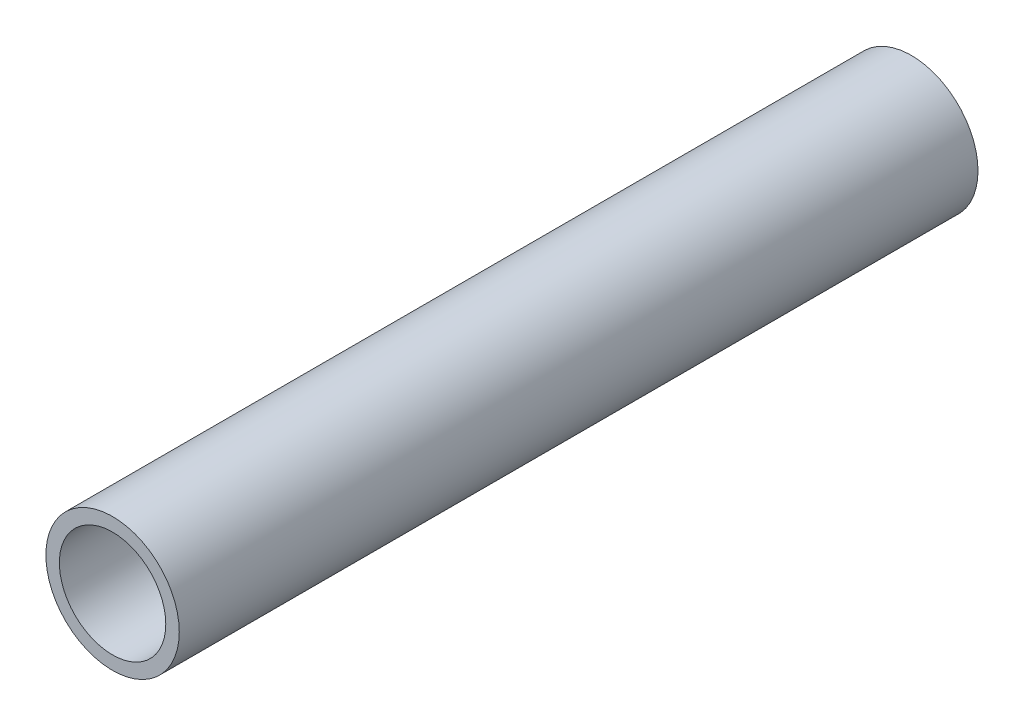
ISO-10303-21;
HEADER;
FILE_DESCRIPTION(('STEP AP214'),'2;1');
FILE_NAME('part.step','',(''),(''),'','','');
FILE_SCHEMA(('AUTOMOTIVE_DESIGN { 1 0 10303 214 1 1 1 1 }'));
ENDSEC;
DATA;
#1=APPLICATION_CONTEXT('core data for automotive mechanical design processes');
#2=APPLICATION_PROTOCOL_DEFINITION('international standard','automotive_design',2000,#1);
#3=PRODUCT_CONTEXT('',#1,'mechanical');
#4=PRODUCT('Part','Part','',(#3));
#5=PRODUCT_RELATED_PRODUCT_CATEGORY('part','',(#4));
#6=PRODUCT_DEFINITION_FORMATION('','',#4);
#7=PRODUCT_DEFINITION_CONTEXT('part definition',#1,'design');
#8=PRODUCT_DEFINITION('design','',#6,#7);
#9=PRODUCT_DEFINITION_SHAPE('','',#8);
#10=(LENGTH_UNIT() NAMED_UNIT(*) SI_UNIT(.MILLI.,.METRE.));
#11=(NAMED_UNIT(*) PLANE_ANGLE_UNIT() SI_UNIT($,.RADIAN.));
#12=(NAMED_UNIT(*) SI_UNIT($,.STERADIAN.) SOLID_ANGLE_UNIT());
#13=UNCERTAINTY_MEASURE_WITH_UNIT(LENGTH_MEASURE(1.E-05),#10,'distance_accuracy_value','');
#14=(GEOMETRIC_REPRESENTATION_CONTEXT(3) GLOBAL_UNCERTAINTY_ASSIGNED_CONTEXT((#13)) GLOBAL_UNIT_ASSIGNED_CONTEXT((#10,
#11,#12)) REPRESENTATION_CONTEXT('',''));
#15=CARTESIAN_POINT('',(0.,0.,0.));
#16=DIRECTION('',(0.,0.,1.));
#17=DIRECTION('',(1.,0.,0.));
#18=AXIS2_PLACEMENT_3D('',#15,#16,#17);
#19=CARTESIAN_POINT('',(0.,0.,100.));
#20=DIRECTION('',(0.,0.,1.));
#21=DIRECTION('',(1.,0.,0.));
#22=AXIS2_PLACEMENT_3D('',#19,#20,#21);
#23=PLANE('',#22);
#24=CARTESIAN_POINT('',(0.,0.,100.));
#25=DIRECTION('',(0.,0.,1.));
#26=DIRECTION('',(1.,0.,0.));
#27=AXIS2_PLACEMENT_3D('',#24,#25,#26);
#28=CIRCLE('',#27,16.7005);
#29=CARTESIAN_POINT('',(16.7005,0.,100.));
#30=VERTEX_POINT('',#29);
#31=EDGE_CURVE('E11',#30,#30,#28,.T.);
#32=ORIENTED_EDGE('',*,*,#31,.T.);
#33=EDGE_LOOP('',(#32));
#34=FACE_BOUND('',#33,.T.);
#35=CARTESIAN_POINT('',(0.,0.,100.));
#36=DIRECTION('',(0.,0.,1.));
#37=DIRECTION('',(1.,0.,0.));
#38=AXIS2_PLACEMENT_3D('',#35,#36,#37);
#39=CIRCLE('',#38,13.3223);
#40=CARTESIAN_POINT('',(13.3223,0.,100.));
#41=VERTEX_POINT('',#40);
#42=EDGE_CURVE('E48',#41,#41,#39,.T.);
#43=ORIENTED_EDGE('',*,*,#42,.F.);
#44=EDGE_LOOP('',(#43));
#45=FACE_BOUND('',#44,.T.);
#46=ADVANCED_FACE('F37',(#34,#45),#23,.T.);
#47=CARTESIAN_POINT('',(0.,0.,-100.));
#48=DIRECTION('',(0.,0.,1.));
#49=DIRECTION('',(1.,0.,0.));
#50=AXIS2_PLACEMENT_3D('',#47,#48,#49);
#51=PLANE('',#50);
#52=CARTESIAN_POINT('',(0.,0.,-100.));
#53=DIRECTION('',(0.,0.,1.));
#54=DIRECTION('',(1.,0.,0.));
#55=AXIS2_PLACEMENT_3D('',#52,#53,#54);
#56=CIRCLE('',#55,16.7005);
#57=CARTESIAN_POINT('',(16.7005,0.,-100.));
#58=VERTEX_POINT('',#57);
#59=EDGE_CURVE('E41',#58,#58,#56,.T.);
#60=ORIENTED_EDGE('',*,*,#59,.F.);
#61=EDGE_LOOP('',(#60));
#62=FACE_BOUND('',#61,.T.);
#63=CARTESIAN_POINT('',(0.,0.,-100.));
#64=DIRECTION('',(0.,0.,1.));
#65=DIRECTION('',(1.,0.,0.));
#66=AXIS2_PLACEMENT_3D('',#63,#64,#65);
#67=CIRCLE('',#66,13.3223);
#68=CARTESIAN_POINT('',(13.3223,0.,-100.));
#69=VERTEX_POINT('',#68);
#70=EDGE_CURVE('E50',#69,#69,#67,.T.);
#71=ORIENTED_EDGE('',*,*,#70,.T.);
#72=EDGE_LOOP('',(#71));
#73=FACE_BOUND('',#72,.T.);
#74=ADVANCED_FACE('F60',(#62,#73),#51,.F.);
#75=CARTESIAN_POINT('',(0.,0.,100.));
#76=DIRECTION('',(0.,0.,-1.));
#77=DIRECTION('',(-1.,0.,0.));
#78=AXIS2_PLACEMENT_3D('',#75,#76,#77);
#79=CYLINDRICAL_SURFACE('',#78,16.7005);
#80=ORIENTED_EDGE('',*,*,#31,.F.);
#81=EDGE_LOOP('',(#80));
#82=FACE_BOUND('',#81,.T.);
#83=ORIENTED_EDGE('',*,*,#59,.T.);
#84=EDGE_LOOP('',(#83));
#85=FACE_BOUND('',#84,.T.);
#86=ADVANCED_FACE('F39',(#82,#85),#79,.T.);
#87=CARTESIAN_POINT('',(0.,0.,100.));
#88=DIRECTION('',(0.,0.,-1.));
#89=DIRECTION('',(-1.,0.,0.));
#90=AXIS2_PLACEMENT_3D('',#87,#88,#89);
#91=CYLINDRICAL_SURFACE('',#90,13.3223);
#92=ORIENTED_EDGE('',*,*,#42,.T.);
#93=EDGE_LOOP('',(#92));
#94=FACE_BOUND('',#93,.T.);
#95=ORIENTED_EDGE('',*,*,#70,.F.);
#96=EDGE_LOOP('',(#95));
#97=FACE_BOUND('',#96,.T.);
#98=ADVANCED_FACE('F56',(#94,#97),#91,.F.);
#99=CLOSED_SHELL('',(#46,#74,#86,#98));
#100=MANIFOLD_SOLID_BREP('B2',#99);
#101=ADVANCED_BREP_SHAPE_REPRESENTATION('',(#18,#100),#14);
#102=SHAPE_DEFINITION_REPRESENTATION(#9,#101);
ENDSEC;
END-ISO-10303-21;
